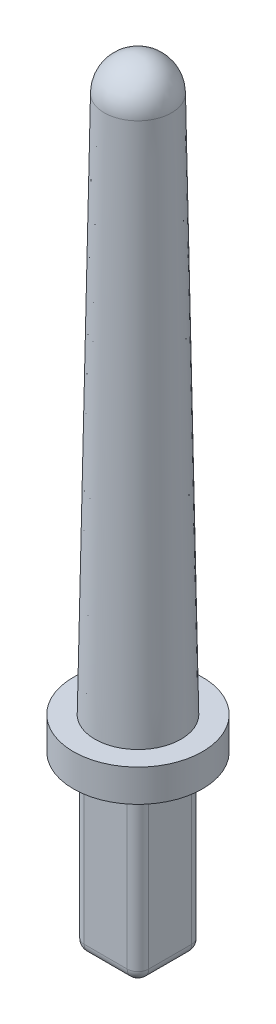
ISO-10303-21;
HEADER;
FILE_DESCRIPTION(('STEP AP214'),'2;1');
FILE_NAME('part.step','',(''),(''),'','','');
FILE_SCHEMA(('AUTOMOTIVE_DESIGN { 1 0 10303 214 1 1 1 1 }'));
ENDSEC;
DATA;
#1=APPLICATION_CONTEXT('core data for automotive mechanical design processes');
#2=APPLICATION_PROTOCOL_DEFINITION('international standard','automotive_design',2000,#1);
#3=PRODUCT_CONTEXT('',#1,'mechanical');
#4=PRODUCT('Part','Part','',(#3));
#5=PRODUCT_RELATED_PRODUCT_CATEGORY('part','',(#4));
#6=PRODUCT_DEFINITION_FORMATION('','',#4);
#7=PRODUCT_DEFINITION_CONTEXT('part definition',#1,'design');
#8=PRODUCT_DEFINITION('design','',#6,#7);
#9=PRODUCT_DEFINITION_SHAPE('','',#8);
#10=(LENGTH_UNIT() NAMED_UNIT(*) SI_UNIT(.MILLI.,.METRE.));
#11=(NAMED_UNIT(*) PLANE_ANGLE_UNIT() SI_UNIT($,.RADIAN.));
#12=(NAMED_UNIT(*) SI_UNIT($,.STERADIAN.) SOLID_ANGLE_UNIT());
#13=UNCERTAINTY_MEASURE_WITH_UNIT(LENGTH_MEASURE(1.E-05),#10,'distance_accuracy_value','');
#14=(GEOMETRIC_REPRESENTATION_CONTEXT(3) GLOBAL_UNCERTAINTY_ASSIGNED_CONTEXT((#13)) GLOBAL_UNIT_ASSIGNED_CONTEXT((#10,
#11,#12)) REPRESENTATION_CONTEXT('',''));
#15=CARTESIAN_POINT('',(0.,0.,0.));
#16=DIRECTION('',(0.,0.,1.));
#17=DIRECTION('',(1.,0.,0.));
#18=AXIS2_PLACEMENT_3D('',#15,#16,#17);
#19=CARTESIAN_POINT('',(3.,-0.701239366382906,3.));
#20=DIRECTION('',(-1.,0.,0.));
#21=DIRECTION('',(0.,0.,1.));
#22=AXIS2_PLACEMENT_3D('',#19,#20,#21);
#23=PLANE('',#22);
#24=DIRECTION('',(0.,0.,-1.));
#25=VECTOR('',#24,1.);
#26=CARTESIAN_POINT('',(3.,-15.7012393663829,-3.));
#27=LINE('',#26,#25);
#28=CARTESIAN_POINT('',(3.,-15.7012393663829,2.));
#29=VERTEX_POINT('',#28);
#30=CARTESIAN_POINT('',(3.,-15.7012393663829,-2.));
#31=VERTEX_POINT('',#30);
#32=EDGE_CURVE('E57',#29,#31,#27,.T.);
#33=ORIENTED_EDGE('',*,*,#32,.T.);
#34=DIRECTION('',(0.,-1.,0.));
#35=VECTOR('',#34,1.);
#36=CARTESIAN_POINT('',(3.,-0.701239366382906,-2.));
#37=LINE('',#36,#35);
#38=CARTESIAN_POINT('',(3.,-0.701239366382906,-2.));
#39=VERTEX_POINT('',#38);
#40=EDGE_CURVE('E175',#31,#39,#37,.F.);
#41=ORIENTED_EDGE('',*,*,#40,.T.);
#42=DIRECTION('',(0.,0.,-1.));
#43=VECTOR('',#42,1.);
#44=CARTESIAN_POINT('',(3.,-0.701239366382906,3.));
#45=LINE('',#44,#43);
#46=CARTESIAN_POINT('',(3.,-0.701239366382906,2.));
#47=VERTEX_POINT('',#46);
#48=EDGE_CURVE('E125',#47,#39,#45,.T.);
#49=ORIENTED_EDGE('',*,*,#48,.F.);
#50=DIRECTION('',(0.,-1.,0.));
#51=VECTOR('',#50,1.);
#52=CARTESIAN_POINT('',(3.,-0.701239366382906,2.));
#53=LINE('',#52,#51);
#54=EDGE_CURVE('E62',#47,#29,#53,.T.);
#55=ORIENTED_EDGE('',*,*,#54,.T.);
#56=EDGE_LOOP('',(#33,#41,#49,#55));
#57=FACE_BOUND('',#56,.T.);
#58=ADVANCED_FACE('F40',(#57),#23,.F.);
#59=CARTESIAN_POINT('',(-3.,-0.701239366382906,-3.));
#60=DIRECTION('',(0.,0.,1.));
#61=DIRECTION('',(1.,0.,0.));
#62=AXIS2_PLACEMENT_3D('',#59,#60,#61);
#63=PLANE('',#62);
#64=DIRECTION('',(-1.,0.,0.));
#65=VECTOR('',#64,1.);
#66=CARTESIAN_POINT('',(-3.,-15.7012393663829,-3.));
#67=LINE('',#66,#65);
#68=CARTESIAN_POINT('',(2.,-15.7012393663829,-3.));
#69=VERTEX_POINT('',#68);
#70=CARTESIAN_POINT('',(-2.,-15.7012393663829,-3.));
#71=VERTEX_POINT('',#70);
#72=EDGE_CURVE('E143',#69,#71,#67,.T.);
#73=ORIENTED_EDGE('',*,*,#72,.T.);
#74=DIRECTION('',(0.,-1.,0.));
#75=VECTOR('',#74,1.);
#76=CARTESIAN_POINT('',(-2.,-0.701239366382906,-3.));
#77=LINE('',#76,#75);
#78=CARTESIAN_POINT('',(-2.,-0.701239366382906,-3.));
#79=VERTEX_POINT('',#78);
#80=EDGE_CURVE('E136',#71,#79,#77,.F.);
#81=ORIENTED_EDGE('',*,*,#80,.T.);
#82=DIRECTION('',(-1.,0.,0.));
#83=VECTOR('',#82,1.);
#84=CARTESIAN_POINT('',(-3.,-0.701239366382906,-3.));
#85=LINE('',#84,#83);
#86=CARTESIAN_POINT('',(2.,-0.701239366382906,-3.));
#87=VERTEX_POINT('',#86);
#88=EDGE_CURVE('E123',#87,#79,#85,.T.);
#89=ORIENTED_EDGE('',*,*,#88,.F.);
#90=DIRECTION('',(0.,-1.,0.));
#91=VECTOR('',#90,1.);
#92=CARTESIAN_POINT('',(2.,-0.701239366382906,-3.));
#93=LINE('',#92,#91);
#94=EDGE_CURVE('E133',#87,#69,#93,.T.);
#95=ORIENTED_EDGE('',*,*,#94,.T.);
#96=EDGE_LOOP('',(#73,#81,#89,#95));
#97=FACE_BOUND('',#96,.T.);
#98=ADVANCED_FACE('F132',(#97),#63,.F.);
#99=CARTESIAN_POINT('',(-3.,-0.701239366382906,3.));
#100=DIRECTION('',(1.,0.,0.));
#101=DIRECTION('',(0.,0.,-1.));
#102=AXIS2_PLACEMENT_3D('',#99,#100,#101);
#103=PLANE('',#102);
#104=DIRECTION('',(0.,0.,1.));
#105=VECTOR('',#104,1.);
#106=CARTESIAN_POINT('',(-3.,-0.701239366382906,3.));
#107=LINE('',#106,#105);
#108=CARTESIAN_POINT('',(-3.,-0.701239366382906,-2.));
#109=VERTEX_POINT('',#108);
#110=CARTESIAN_POINT('',(-3.,-0.701239366382906,2.));
#111=VERTEX_POINT('',#110);
#112=EDGE_CURVE('E137',#109,#111,#107,.T.);
#113=ORIENTED_EDGE('',*,*,#112,.F.);
#114=DIRECTION('',(0.,-1.,0.));
#115=VECTOR('',#114,1.);
#116=CARTESIAN_POINT('',(-3.,-0.701239366382906,-2.));
#117=LINE('',#116,#115);
#118=CARTESIAN_POINT('',(-3.,-15.7012393663829,-2.));
#119=VERTEX_POINT('',#118);
#120=EDGE_CURVE('E165',#109,#119,#117,.T.);
#121=ORIENTED_EDGE('',*,*,#120,.T.);
#122=DIRECTION('',(0.,0.,1.));
#123=VECTOR('',#122,1.);
#124=CARTESIAN_POINT('',(-3.,-15.7012393663829,3.));
#125=LINE('',#124,#123);
#126=CARTESIAN_POINT('',(-3.,-15.7012393663829,2.));
#127=VERTEX_POINT('',#126);
#128=EDGE_CURVE('E163',#119,#127,#125,.T.);
#129=ORIENTED_EDGE('',*,*,#128,.T.);
#130=DIRECTION('',(0.,-1.,0.));
#131=VECTOR('',#130,1.);
#132=CARTESIAN_POINT('',(-3.,-0.701239366382906,2.));
#133=LINE('',#132,#131);
#134=EDGE_CURVE('E161',#127,#111,#133,.F.);
#135=ORIENTED_EDGE('',*,*,#134,.T.);
#136=EDGE_LOOP('',(#113,#121,#129,#135));
#137=FACE_BOUND('',#136,.T.);
#138=ADVANCED_FACE('F269',(#137),#103,.F.);
#139=CARTESIAN_POINT('',(-3.,-0.701239366382906,3.));
#140=DIRECTION('',(0.,0.,-1.));
#141=DIRECTION('',(-1.,0.,0.));
#142=AXIS2_PLACEMENT_3D('',#139,#140,#141);
#143=PLANE('',#142);
#144=DIRECTION('',(1.,0.,0.));
#145=VECTOR('',#144,1.);
#146=CARTESIAN_POINT('',(-3.,-0.701239366382906,3.));
#147=LINE('',#146,#145);
#148=CARTESIAN_POINT('',(-2.,-0.701239366382906,3.));
#149=VERTEX_POINT('',#148);
#150=CARTESIAN_POINT('',(2.,-0.701239366382906,3.));
#151=VERTEX_POINT('',#150);
#152=EDGE_CURVE('E144',#149,#151,#147,.T.);
#153=ORIENTED_EDGE('',*,*,#152,.F.);
#154=DIRECTION('',(0.,-1.,0.));
#155=VECTOR('',#154,1.);
#156=CARTESIAN_POINT('',(-2.,-0.701239366382906,3.));
#157=LINE('',#156,#155);
#158=CARTESIAN_POINT('',(-2.,-15.7012393663829,3.));
#159=VERTEX_POINT('',#158);
#160=EDGE_CURVE('E171',#149,#159,#157,.T.);
#161=ORIENTED_EDGE('',*,*,#160,.T.);
#162=DIRECTION('',(1.,0.,0.));
#163=VECTOR('',#162,1.);
#164=CARTESIAN_POINT('',(3.,-15.7012393663829,3.));
#165=LINE('',#164,#163);
#166=CARTESIAN_POINT('',(2.,-15.7012393663829,3.));
#167=VERTEX_POINT('',#166);
#168=EDGE_CURVE('E169',#159,#167,#165,.T.);
#169=ORIENTED_EDGE('',*,*,#168,.T.);
#170=DIRECTION('',(0.,-1.,0.));
#171=VECTOR('',#170,1.);
#172=CARTESIAN_POINT('',(2.,-0.701239366382906,3.));
#173=LINE('',#172,#171);
#174=EDGE_CURVE('E167',#167,#151,#173,.F.);
#175=ORIENTED_EDGE('',*,*,#174,.T.);
#176=EDGE_LOOP('',(#153,#161,#169,#175));
#177=FACE_BOUND('',#176,.T.);
#178=ADVANCED_FACE('F237',(#177),#143,.F.);
#179=CARTESIAN_POINT('',(0.,-16.7012393663829,0.));
#180=DIRECTION('',(0.,-1.,0.));
#181=DIRECTION('',(0.,0.,-1.));
#182=AXIS2_PLACEMENT_3D('',#179,#180,#181);
#183=PLANE('',#182);
#184=DIRECTION('',(0.,0.,1.));
#185=VECTOR('',#184,1.);
#186=CARTESIAN_POINT('',(-2.,-16.7012393663829,-3.));
#187=LINE('',#186,#185);
#188=CARTESIAN_POINT('',(-2.,-16.7012393663829,2.));
#189=VERTEX_POINT('',#188);
#190=CARTESIAN_POINT('',(-2.,-16.7012393663829,-2.));
#191=VERTEX_POINT('',#190);
#192=EDGE_CURVE('E156',#189,#191,#187,.F.);
#193=ORIENTED_EDGE('',*,*,#192,.T.);
#194=DIRECTION('',(-1.,0.,0.));
#195=VECTOR('',#194,1.);
#196=CARTESIAN_POINT('',(3.,-16.7012393663829,-2.));
#197=LINE('',#196,#195);
#198=CARTESIAN_POINT('',(2.,-16.7012393663829,-2.));
#199=VERTEX_POINT('',#198);
#200=EDGE_CURVE('E158',#191,#199,#197,.F.);
#201=ORIENTED_EDGE('',*,*,#200,.T.);
#202=DIRECTION('',(0.,0.,-1.));
#203=VECTOR('',#202,1.);
#204=CARTESIAN_POINT('',(2.,-16.7012393663829,3.));
#205=LINE('',#204,#203);
#206=CARTESIAN_POINT('',(2.,-16.7012393663829,2.));
#207=VERTEX_POINT('',#206);
#208=EDGE_CURVE('E152',#199,#207,#205,.F.);
#209=ORIENTED_EDGE('',*,*,#208,.T.);
#210=DIRECTION('',(1.,0.,0.));
#211=VECTOR('',#210,1.);
#212=CARTESIAN_POINT('',(-3.,-16.7012393663829,2.));
#213=LINE('',#212,#211);
#214=EDGE_CURVE('E154',#207,#189,#213,.F.);
#215=ORIENTED_EDGE('',*,*,#214,.T.);
#216=EDGE_LOOP('',(#193,#201,#209,#215));
#217=FACE_BOUND('',#216,.T.);
#218=ADVANCED_FACE('F245',(#217),#183,.T.);
#219=CARTESIAN_POINT('',(0.,-0.701239366382906,0.));
#220=DIRECTION('',(0.,1.,0.));
#221=DIRECTION('',(0.,0.,1.));
#222=AXIS2_PLACEMENT_3D('',#219,#220,#221);
#223=PLANE('',#222);
#224=CARTESIAN_POINT('',(0.,-0.701239366382906,0.));
#225=DIRECTION('',(0.,1.,0.));
#226=DIRECTION('',(0.,0.,1.));
#227=AXIS2_PLACEMENT_3D('',#224,#225,#226);
#228=CIRCLE('',#227,6.);
#229=CARTESIAN_POINT('',(0.,-0.701239366382906,6.));
#230=VERTEX_POINT('',#229);
#231=EDGE_CURVE('E217',#230,#230,#228,.T.);
#232=ORIENTED_EDGE('',*,*,#231,.F.);
#233=EDGE_LOOP('',(#232));
#234=FACE_BOUND('',#233,.T.);
#235=ORIENTED_EDGE('',*,*,#112,.T.);
#236=CARTESIAN_POINT('',(-2.,-0.701239366382906,2.));
#237=DIRECTION('',(0.,1.,0.));
#238=DIRECTION('',(0.,0.,1.));
#239=AXIS2_PLACEMENT_3D('',#236,#237,#238);
#240=CIRCLE('',#239,1.);
#241=EDGE_CURVE('E49',#111,#149,#240,.T.);
#242=ORIENTED_EDGE('',*,*,#241,.T.);
#243=ORIENTED_EDGE('',*,*,#152,.T.);
#244=CARTESIAN_POINT('',(2.,-0.701239366382906,2.));
#245=DIRECTION('',(0.,1.,0.));
#246=DIRECTION('',(0.,0.,1.));
#247=AXIS2_PLACEMENT_3D('',#244,#245,#246);
#248=CIRCLE('',#247,1.);
#249=EDGE_CURVE('E11',#151,#47,#248,.T.);
#250=ORIENTED_EDGE('',*,*,#249,.T.);
#251=ORIENTED_EDGE('',*,*,#48,.T.);
#252=CARTESIAN_POINT('',(2.,-0.701239366382906,-2.));
#253=DIRECTION('',(0.,1.,0.));
#254=DIRECTION('',(0.,0.,1.));
#255=AXIS2_PLACEMENT_3D('',#252,#253,#254);
#256=CIRCLE('',#255,1.);
#257=EDGE_CURVE('E119',#39,#87,#256,.T.);
#258=ORIENTED_EDGE('',*,*,#257,.T.);
#259=ORIENTED_EDGE('',*,*,#88,.T.);
#260=CARTESIAN_POINT('',(-2.,-0.701239366382906,-2.));
#261=DIRECTION('',(0.,1.,0.));
#262=DIRECTION('',(0.,0.,1.));
#263=AXIS2_PLACEMENT_3D('',#260,#261,#262);
#264=CIRCLE('',#263,1.);
#265=EDGE_CURVE('E128',#79,#109,#264,.T.);
#266=ORIENTED_EDGE('',*,*,#265,.T.);
#267=EDGE_LOOP('',(#235,#242,#243,#250,#251,#258,#259,#266));
#268=FACE_BOUND('',#267,.T.);
#269=ADVANCED_FACE('F122',(#234,#268),#223,.F.);
#270=CARTESIAN_POINT('',(0.,2.29876063361709,0.));
#271=DIRECTION('',(0.,-1.,0.));
#272=DIRECTION('',(0.,0.,-1.));
#273=AXIS2_PLACEMENT_3D('',#270,#271,#272);
#274=CYLINDRICAL_SURFACE('',#273,6.);
#275=CARTESIAN_POINT('',(0.,2.29876063361709,0.));
#276=DIRECTION('',(0.,1.,0.));
#277=DIRECTION('',(0.,0.,1.));
#278=AXIS2_PLACEMENT_3D('',#275,#276,#277);
#279=CIRCLE('',#278,6.);
#280=CARTESIAN_POINT('',(0.,2.29876063361709,6.));
#281=VERTEX_POINT('',#280);
#282=EDGE_CURVE('E220',#281,#281,#279,.T.);
#283=ORIENTED_EDGE('',*,*,#282,.F.);
#284=EDGE_LOOP('',(#283));
#285=FACE_BOUND('',#284,.T.);
#286=ORIENTED_EDGE('',*,*,#231,.T.);
#287=EDGE_LOOP('',(#286));
#288=FACE_BOUND('',#287,.T.);
#289=ADVANCED_FACE('F393',(#285,#288),#274,.T.);
#290=CARTESIAN_POINT('',(0.,2.29876063361709,0.));
#291=DIRECTION('',(0.,1.,0.));
#292=DIRECTION('',(0.,0.,1.));
#293=AXIS2_PLACEMENT_3D('',#290,#291,#292);
#294=PLANE('',#293);
#295=CARTESIAN_POINT('',(0.,2.29876063361709,0.));
#296=DIRECTION('',(0.,1.,0.));
#297=DIRECTION('',(0.,0.,1.));
#298=AXIS2_PLACEMENT_3D('',#295,#296,#297);
#299=CIRCLE('',#298,4.);
#300=CARTESIAN_POINT('',(0.,2.29876063361709,4.));
#301=VERTEX_POINT('',#300);
#302=EDGE_CURVE('E209',#301,#301,#299,.T.);
#303=ORIENTED_EDGE('',*,*,#302,.F.);
#304=EDGE_LOOP('',(#303));
#305=FACE_BOUND('',#304,.T.);
#306=ORIENTED_EDGE('',*,*,#282,.T.);
#307=EDGE_LOOP('',(#306));
#308=FACE_BOUND('',#307,.T.);
#309=ADVANCED_FACE('F383',(#305,#308),#294,.T.);
#310=CARTESIAN_POINT('',(0.,2.29876063361709,0.));
#311=DIRECTION('',(0.,-1.,0.));
#312=DIRECTION('',(0.,0.,1.));
#313=AXIS2_PLACEMENT_3D('',#310,#311,#312);
#314=CONICAL_SURFACE('',#313,4.,0.0174532925199433);
#315=CARTESIAN_POINT('',(0.,52.2987606336171,0.));
#316=DIRECTION('',(0.,1.,0.));
#317=DIRECTION('',(0.,0.,1.));
#318=AXIS2_PLACEMENT_3D('',#315,#316,#317);
#319=CIRCLE('',#318,3.12724675358912);
#320=CARTESIAN_POINT('',(0.,52.2987606336171,3.12724675358912));
#321=VERTEX_POINT('',#320);
#322=EDGE_CURVE('E212',#321,#321,#319,.T.);
#323=ORIENTED_EDGE('',*,*,#322,.F.);
#324=EDGE_LOOP('',(#323));
#325=FACE_BOUND('',#324,.T.);
#326=ORIENTED_EDGE('',*,*,#302,.T.);
#327=EDGE_LOOP('',(#326));
#328=FACE_BOUND('',#327,.T.);
#329=ADVANCED_FACE('F374',(#325,#328),#314,.T.);
#330=CARTESIAN_POINT('',(0.,52.2987606336171,0.));
#331=DIRECTION('',(0.,0.,1.));
#332=DIRECTION('',(1.,0.,0.));
#333=AXIS2_PLACEMENT_3D('',#330,#331,#332);
#334=SPHERICAL_SURFACE('',#333,3.12724675358912);
#335=CARTESIAN_POINT('',(0.,52.2987606336171,0.));
#336=DIRECTION('',(0.,1.,0.));
#337=DIRECTION('',(0.,0.,1.));
#338=AXIS2_PLACEMENT_3D('',#335,#336,#337);
#339=SPHERICAL_SURFACE('',#338,3.12724675358912);
#340=ORIENTED_EDGE('',*,*,#322,.T.);
#341=EDGE_LOOP('',(#340));
#342=FACE_BOUND('',#341,.T.);
#343=ADVANCED_FACE('F365',(#342),#339,.T.);
#344=CARTESIAN_POINT('',(2.,-0.701239366382906,2.));
#345=DIRECTION('',(0.,-1.,0.));
#346=DIRECTION('',(0.,0.,-1.));
#347=AXIS2_PLACEMENT_3D('',#344,#345,#346);
#348=CYLINDRICAL_SURFACE('',#347,1.);
#349=ORIENTED_EDGE('',*,*,#249,.F.);
#350=ORIENTED_EDGE('',*,*,#174,.F.);
#351=CARTESIAN_POINT('',(2.,-15.7012393663829,2.));
#352=DIRECTION('',(0.,-1.,0.));
#353=DIRECTION('',(0.,0.,-1.));
#354=AXIS2_PLACEMENT_3D('',#351,#352,#353);
#355=CIRCLE('',#354,1.);
#356=EDGE_CURVE('E204',#29,#167,#355,.T.);
#357=ORIENTED_EDGE('',*,*,#356,.F.);
#358=ORIENTED_EDGE('',*,*,#54,.F.);
#359=EDGE_LOOP('',(#349,#350,#357,#358));
#360=FACE_BOUND('',#359,.T.);
#361=ADVANCED_FACE('F42',(#360),#348,.T.);
#362=CARTESIAN_POINT('',(-2.,-0.701239366382906,2.));
#363=DIRECTION('',(0.,-1.,0.));
#364=DIRECTION('',(0.,0.,-1.));
#365=AXIS2_PLACEMENT_3D('',#362,#363,#364);
#366=CYLINDRICAL_SURFACE('',#365,1.);
#367=ORIENTED_EDGE('',*,*,#241,.F.);
#368=ORIENTED_EDGE('',*,*,#134,.F.);
#369=CARTESIAN_POINT('',(-2.,-15.7012393663829,2.));
#370=DIRECTION('',(0.,-1.,0.));
#371=DIRECTION('',(0.,0.,-1.));
#372=AXIS2_PLACEMENT_3D('',#369,#370,#371);
#373=CIRCLE('',#372,1.);
#374=EDGE_CURVE('E202',#159,#127,#373,.T.);
#375=ORIENTED_EDGE('',*,*,#374,.F.);
#376=ORIENTED_EDGE('',*,*,#160,.F.);
#377=EDGE_LOOP('',(#367,#368,#375,#376));
#378=FACE_BOUND('',#377,.T.);
#379=ADVANCED_FACE('F233',(#378),#366,.T.);
#380=CARTESIAN_POINT('',(-3.,-15.7012393663829,2.));
#381=DIRECTION('',(-1.,0.,0.));
#382=DIRECTION('',(0.,0.,1.));
#383=AXIS2_PLACEMENT_3D('',#380,#381,#382);
#384=CYLINDRICAL_SURFACE('',#383,1.);
#385=CARTESIAN_POINT('',(2.,-15.7012393663829,2.));
#386=DIRECTION('',(1.,0.,0.));
#387=DIRECTION('',(0.,0.,-1.));
#388=AXIS2_PLACEMENT_3D('',#385,#386,#387);
#389=CIRCLE('',#388,1.);
#390=EDGE_CURVE('E44',#167,#207,#389,.T.);
#391=ORIENTED_EDGE('',*,*,#390,.F.);
#392=ORIENTED_EDGE('',*,*,#168,.F.);
#393=CARTESIAN_POINT('',(-2.,-15.7012393663829,2.));
#394=DIRECTION('',(-1.,0.,0.));
#395=DIRECTION('',(0.,0.,1.));
#396=AXIS2_PLACEMENT_3D('',#393,#394,#395);
#397=CIRCLE('',#396,1.);
#398=EDGE_CURVE('E199',#189,#159,#397,.T.);
#399=ORIENTED_EDGE('',*,*,#398,.F.);
#400=ORIENTED_EDGE('',*,*,#214,.F.);
#401=EDGE_LOOP('',(#391,#392,#399,#400));
#402=FACE_BOUND('',#401,.T.);
#403=ADVANCED_FACE('F241',(#402),#384,.T.);
#404=CARTESIAN_POINT('',(2.,-15.7012393663829,2.));
#405=DIRECTION('',(0.,0.,1.));
#406=DIRECTION('',(1.,0.,0.));
#407=AXIS2_PLACEMENT_3D('',#404,#405,#406);
#408=SPHERICAL_SURFACE('',#407,1.);
#409=ORIENTED_EDGE('',*,*,#356,.T.);
#410=ORIENTED_EDGE('',*,*,#390,.T.);
#411=CARTESIAN_POINT('',(2.,-15.7012393663829,2.));
#412=DIRECTION('',(0.,0.,1.));
#413=DIRECTION('',(1.,0.,0.));
#414=AXIS2_PLACEMENT_3D('',#411,#412,#413);
#415=CIRCLE('',#414,1.);
#416=EDGE_CURVE('E196',#29,#207,#415,.F.);
#417=ORIENTED_EDGE('',*,*,#416,.F.);
#418=EDGE_LOOP('',(#409,#410,#417));
#419=FACE_BOUND('',#418,.T.);
#420=ADVANCED_FACE('F253',(#419),#408,.T.);
#421=CARTESIAN_POINT('',(-2.,-15.7012393663829,2.));
#422=DIRECTION('',(0.,0.,1.));
#423=DIRECTION('',(1.,0.,0.));
#424=AXIS2_PLACEMENT_3D('',#421,#422,#423);
#425=SPHERICAL_SURFACE('',#424,1.);
#426=ORIENTED_EDGE('',*,*,#398,.T.);
#427=ORIENTED_EDGE('',*,*,#374,.T.);
#428=CARTESIAN_POINT('',(-2.,-15.7012393663829,2.));
#429=DIRECTION('',(0.,0.,1.));
#430=DIRECTION('',(1.,0.,0.));
#431=AXIS2_PLACEMENT_3D('',#428,#429,#430);
#432=CIRCLE('',#431,1.);
#433=EDGE_CURVE('E193',#189,#127,#432,.F.);
#434=ORIENTED_EDGE('',*,*,#433,.F.);
#435=EDGE_LOOP('',(#426,#427,#434));
#436=FACE_BOUND('',#435,.T.);
#437=ADVANCED_FACE('F255',(#436),#425,.T.);
#438=CARTESIAN_POINT('',(2.,-15.7012393663829,3.));
#439=DIRECTION('',(0.,0.,1.));
#440=DIRECTION('',(1.,0.,0.));
#441=AXIS2_PLACEMENT_3D('',#438,#439,#440);
#442=CYLINDRICAL_SURFACE('',#441,1.);
#443=ORIENTED_EDGE('',*,*,#416,.T.);
#444=ORIENTED_EDGE('',*,*,#208,.F.);
#445=CARTESIAN_POINT('',(2.,-15.7012393663829,-2.));
#446=DIRECTION('',(0.,0.,-1.));
#447=DIRECTION('',(-1.,0.,0.));
#448=AXIS2_PLACEMENT_3D('',#445,#446,#447);
#449=CIRCLE('',#448,1.);
#450=EDGE_CURVE('E190',#31,#199,#449,.T.);
#451=ORIENTED_EDGE('',*,*,#450,.F.);
#452=ORIENTED_EDGE('',*,*,#32,.F.);
#453=EDGE_LOOP('',(#443,#444,#451,#452));
#454=FACE_BOUND('',#453,.T.);
#455=ADVANCED_FACE('F252',(#454),#442,.T.);
#456=CARTESIAN_POINT('',(2.,-0.701239366382906,-2.));
#457=DIRECTION('',(0.,-1.,0.));
#458=DIRECTION('',(0.,0.,-1.));
#459=AXIS2_PLACEMENT_3D('',#456,#457,#458);
#460=CYLINDRICAL_SURFACE('',#459,1.);
#461=ORIENTED_EDGE('',*,*,#257,.F.);
#462=ORIENTED_EDGE('',*,*,#40,.F.);
#463=CARTESIAN_POINT('',(2.,-15.7012393663829,-2.));
#464=DIRECTION('',(0.,-1.,0.));
#465=DIRECTION('',(0.,0.,-1.));
#466=AXIS2_PLACEMENT_3D('',#463,#464,#465);
#467=CIRCLE('',#466,1.);
#468=EDGE_CURVE('E141',#69,#31,#467,.T.);
#469=ORIENTED_EDGE('',*,*,#468,.F.);
#470=ORIENTED_EDGE('',*,*,#94,.F.);
#471=EDGE_LOOP('',(#461,#462,#469,#470));
#472=FACE_BOUND('',#471,.T.);
#473=ADVANCED_FACE('F139',(#472),#460,.T.);
#474=CARTESIAN_POINT('',(-2.,-0.701239366382906,-2.));
#475=DIRECTION('',(0.,-1.,0.));
#476=DIRECTION('',(0.,0.,-1.));
#477=AXIS2_PLACEMENT_3D('',#474,#475,#476);
#478=CYLINDRICAL_SURFACE('',#477,1.);
#479=ORIENTED_EDGE('',*,*,#265,.F.);
#480=ORIENTED_EDGE('',*,*,#80,.F.);
#481=CARTESIAN_POINT('',(-2.,-15.7012393663829,-2.));
#482=DIRECTION('',(0.,-1.,0.));
#483=DIRECTION('',(0.,0.,-1.));
#484=AXIS2_PLACEMENT_3D('',#481,#482,#483);
#485=CIRCLE('',#484,1.);
#486=EDGE_CURVE('E186',#119,#71,#485,.T.);
#487=ORIENTED_EDGE('',*,*,#486,.F.);
#488=ORIENTED_EDGE('',*,*,#120,.F.);
#489=EDGE_LOOP('',(#479,#480,#487,#488));
#490=FACE_BOUND('',#489,.T.);
#491=ADVANCED_FACE('F288',(#490),#478,.T.);
#492=CARTESIAN_POINT('',(-2.,-15.7012393663829,3.));
#493=DIRECTION('',(0.,0.,-1.));
#494=DIRECTION('',(-1.,0.,0.));
#495=AXIS2_PLACEMENT_3D('',#492,#493,#494);
#496=CYLINDRICAL_SURFACE('',#495,1.);
#497=ORIENTED_EDGE('',*,*,#433,.T.);
#498=ORIENTED_EDGE('',*,*,#128,.F.);
#499=CARTESIAN_POINT('',(-2.,-15.7012393663829,-2.));
#500=DIRECTION('',(0.,0.,-1.));
#501=DIRECTION('',(-1.,0.,0.));
#502=AXIS2_PLACEMENT_3D('',#499,#500,#501);
#503=CIRCLE('',#502,1.);
#504=EDGE_CURVE('E183',#191,#119,#503,.T.);
#505=ORIENTED_EDGE('',*,*,#504,.F.);
#506=ORIENTED_EDGE('',*,*,#192,.F.);
#507=EDGE_LOOP('',(#497,#498,#505,#506));
#508=FACE_BOUND('',#507,.T.);
#509=ADVANCED_FACE('F284',(#508),#496,.T.);
#510=CARTESIAN_POINT('',(2.,-15.7012393663829,-2.));
#511=DIRECTION('',(0.,0.,1.));
#512=DIRECTION('',(1.,0.,0.));
#513=AXIS2_PLACEMENT_3D('',#510,#511,#512);
#514=SPHERICAL_SURFACE('',#513,1.);
#515=ORIENTED_EDGE('',*,*,#468,.T.);
#516=ORIENTED_EDGE('',*,*,#450,.T.);
#517=CARTESIAN_POINT('',(2.,-15.7012393663829,-2.));
#518=DIRECTION('',(1.,0.,0.));
#519=DIRECTION('',(0.,0.,-1.));
#520=AXIS2_PLACEMENT_3D('',#517,#518,#519);
#521=CIRCLE('',#520,1.);
#522=EDGE_CURVE('E181',#69,#199,#521,.F.);
#523=ORIENTED_EDGE('',*,*,#522,.F.);
#524=EDGE_LOOP('',(#515,#516,#523));
#525=FACE_BOUND('',#524,.T.);
#526=ADVANCED_FACE('F280',(#525),#514,.T.);
#527=CARTESIAN_POINT('',(-2.,-15.7012393663829,-2.));
#528=DIRECTION('',(0.,0.,1.));
#529=DIRECTION('',(1.,0.,0.));
#530=AXIS2_PLACEMENT_3D('',#527,#528,#529);
#531=SPHERICAL_SURFACE('',#530,1.);
#532=ORIENTED_EDGE('',*,*,#504,.T.);
#533=ORIENTED_EDGE('',*,*,#486,.T.);
#534=CARTESIAN_POINT('',(-2.,-15.7012393663829,-2.));
#535=DIRECTION('',(-1.,0.,0.));
#536=DIRECTION('',(0.,0.,1.));
#537=AXIS2_PLACEMENT_3D('',#534,#535,#536);
#538=CIRCLE('',#537,1.);
#539=EDGE_CURVE('E179',#191,#71,#538,.F.);
#540=ORIENTED_EDGE('',*,*,#539,.F.);
#541=EDGE_LOOP('',(#532,#533,#540));
#542=FACE_BOUND('',#541,.T.);
#543=ADVANCED_FACE('F276',(#542),#531,.T.);
#544=CARTESIAN_POINT('',(-3.,-15.7012393663829,-2.));
#545=DIRECTION('',(1.,0.,0.));
#546=DIRECTION('',(0.,0.,-1.));
#547=AXIS2_PLACEMENT_3D('',#544,#545,#546);
#548=CYLINDRICAL_SURFACE('',#547,1.);
#549=ORIENTED_EDGE('',*,*,#522,.T.);
#550=ORIENTED_EDGE('',*,*,#200,.F.);
#551=ORIENTED_EDGE('',*,*,#539,.T.);
#552=ORIENTED_EDGE('',*,*,#72,.F.);
#553=EDGE_LOOP('',(#549,#550,#551,#552));
#554=FACE_BOUND('',#553,.T.);
#555=ADVANCED_FACE('F273',(#554),#548,.T.);
#556=CLOSED_SHELL('',(#58,#98,#138,#178,#218,#269,#289,#309,#329,#343,#361,#379,#403,#420,#437,
#455,#473,#491,#509,#526,#543,#555));
#557=MANIFOLD_SOLID_BREP('B2',#556);
#558=ADVANCED_BREP_SHAPE_REPRESENTATION('',(#18,#557),#14);
#559=SHAPE_DEFINITION_REPRESENTATION(#9,#558);
ENDSEC;
END-ISO-10303-21;
